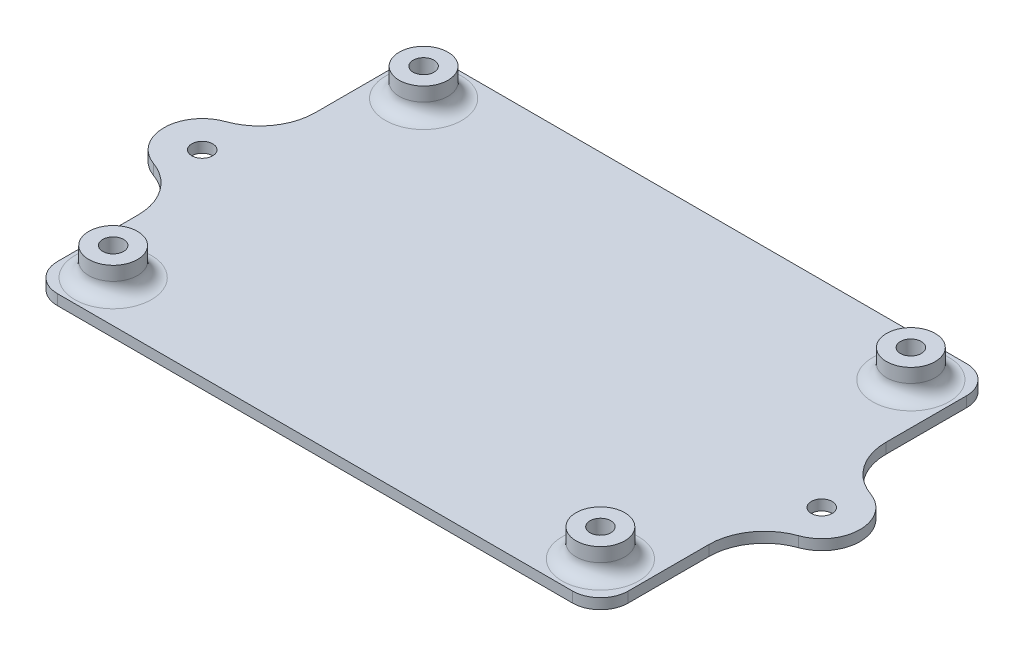
ISO-10303-21;
HEADER;
FILE_DESCRIPTION(('STEP AP214'),'2;1');
FILE_NAME('part.step','',(''),(''),'','','');
FILE_SCHEMA(('AUTOMOTIVE_DESIGN { 1 0 10303 214 1 1 1 1 }'));
ENDSEC;
DATA;
#1=APPLICATION_CONTEXT('core data for automotive mechanical design processes');
#2=APPLICATION_PROTOCOL_DEFINITION('international standard','automotive_design',2000,#1);
#3=PRODUCT_CONTEXT('',#1,'mechanical');
#4=PRODUCT('Part','Part','',(#3));
#5=PRODUCT_RELATED_PRODUCT_CATEGORY('part','',(#4));
#6=PRODUCT_DEFINITION_FORMATION('','',#4);
#7=PRODUCT_DEFINITION_CONTEXT('part definition',#1,'design');
#8=PRODUCT_DEFINITION('design','',#6,#7);
#9=PRODUCT_DEFINITION_SHAPE('','',#8);
#10=(LENGTH_UNIT() NAMED_UNIT(*) SI_UNIT(.MILLI.,.METRE.));
#11=(NAMED_UNIT(*) PLANE_ANGLE_UNIT() SI_UNIT($,.RADIAN.));
#12=(NAMED_UNIT(*) SI_UNIT($,.STERADIAN.) SOLID_ANGLE_UNIT());
#13=UNCERTAINTY_MEASURE_WITH_UNIT(LENGTH_MEASURE(1.E-05),#10,'distance_accuracy_value','');
#14=(GEOMETRIC_REPRESENTATION_CONTEXT(3) GLOBAL_UNCERTAINTY_ASSIGNED_CONTEXT((#13)) GLOBAL_UNIT_ASSIGNED_CONTEXT((#10,
#11,#12)) REPRESENTATION_CONTEXT('',''));
#15=CARTESIAN_POINT('',(0.,0.,0.));
#16=DIRECTION('',(0.,0.,1.));
#17=DIRECTION('',(1.,0.,0.));
#18=AXIS2_PLACEMENT_3D('',#15,#16,#17);
#19=CARTESIAN_POINT('',(0.,1.5,28.3));
#20=DIRECTION('',(0.,0.,-1.));
#21=DIRECTION('',(-1.,0.,0.));
#22=AXIS2_PLACEMENT_3D('',#19,#20,#21);
#23=PLANE('',#22);
#24=DIRECTION('',(1.,0.,0.));
#25=VECTOR('',#24,1.);
#26=CARTESIAN_POINT('',(0.,1.5,28.3));
#27=LINE('',#26,#25);
#28=CARTESIAN_POINT('',(-37.,1.5,28.3));
#29=VERTEX_POINT('',#28);
#30=CARTESIAN_POINT('',(37.,1.5,28.3));
#31=VERTEX_POINT('',#30);
#32=EDGE_CURVE('E166',#29,#31,#27,.T.);
#33=ORIENTED_EDGE('',*,*,#32,.F.);
#34=DIRECTION('',(0.,-1.,0.));
#35=VECTOR('',#34,1.);
#36=CARTESIAN_POINT('',(-37.,0.,28.3));
#37=LINE('',#36,#35);
#38=CARTESIAN_POINT('',(-37.,0.,28.3));
#39=VERTEX_POINT('',#38);
#40=EDGE_CURVE('E284',#29,#39,#37,.T.);
#41=ORIENTED_EDGE('',*,*,#40,.T.);
#42=DIRECTION('',(1.,0.,0.));
#43=VECTOR('',#42,1.);
#44=CARTESIAN_POINT('',(0.,0.,28.3));
#45=LINE('',#44,#43);
#46=CARTESIAN_POINT('',(37.,0.,28.3));
#47=VERTEX_POINT('',#46);
#48=EDGE_CURVE('E208',#39,#47,#45,.T.);
#49=ORIENTED_EDGE('',*,*,#48,.T.);
#50=DIRECTION('',(0.,-1.,0.));
#51=VECTOR('',#50,1.);
#52=CARTESIAN_POINT('',(37.,1.5,28.3));
#53=LINE('',#52,#51);
#54=EDGE_CURVE('E282',#47,#31,#53,.F.);
#55=ORIENTED_EDGE('',*,*,#54,.T.);
#56=EDGE_LOOP('',(#33,#41,#49,#55));
#57=FACE_BOUND('',#56,.T.);
#58=ADVANCED_FACE('F37',(#57),#23,.F.);
#59=CARTESIAN_POINT('',(41.,1.5,0.));
#60=DIRECTION('',(-1.,0.,0.));
#61=DIRECTION('',(0.,0.,1.));
#62=AXIS2_PLACEMENT_3D('',#59,#60,#61);
#63=PLANE('',#62);
#64=DIRECTION('',(0.,0.,-1.));
#65=VECTOR('',#64,1.);
#66=CARTESIAN_POINT('',(41.,1.5,0.));
#67=LINE('',#66,#65);
#68=CARTESIAN_POINT('',(41.,1.5,24.3));
#69=VERTEX_POINT('',#68);
#70=CARTESIAN_POINT('',(41.,1.5,12.7279220613579));
#71=VERTEX_POINT('',#70);
#72=EDGE_CURVE('E151',#69,#71,#67,.T.);
#73=ORIENTED_EDGE('',*,*,#72,.F.);
#74=DIRECTION('',(0.,-1.,0.));
#75=VECTOR('',#74,1.);
#76=CARTESIAN_POINT('',(41.,1.5,24.3));
#77=LINE('',#76,#75);
#78=CARTESIAN_POINT('',(41.,0.,24.3));
#79=VERTEX_POINT('',#78);
#80=EDGE_CURVE('E302',#69,#79,#77,.T.);
#81=ORIENTED_EDGE('',*,*,#80,.T.);
#82=DIRECTION('',(0.,0.,-1.));
#83=VECTOR('',#82,1.);
#84=CARTESIAN_POINT('',(41.,0.,0.));
#85=LINE('',#84,#83);
#86=CARTESIAN_POINT('',(41.,0.,12.7279220613579));
#87=VERTEX_POINT('',#86);
#88=EDGE_CURVE('E173',#79,#87,#85,.T.);
#89=ORIENTED_EDGE('',*,*,#88,.T.);
#90=DIRECTION('',(0.,-1.,0.));
#91=VECTOR('',#90,1.);
#92=CARTESIAN_POINT('',(41.,1.5,12.7279220613579));
#93=LINE('',#92,#91);
#94=EDGE_CURVE('E170',#71,#87,#93,.T.);
#95=ORIENTED_EDGE('',*,*,#94,.F.);
#96=EDGE_LOOP('',(#73,#81,#89,#95));
#97=FACE_BOUND('',#96,.T.);
#98=ADVANCED_FACE('F171',(#97),#63,.F.);
#99=CARTESIAN_POINT('',(49.,1.5,12.7279220613579));
#100=DIRECTION('',(0.,-1.,0.));
#101=DIRECTION('',(0.,0.,-1.));
#102=AXIS2_PLACEMENT_3D('',#99,#100,#101);
#103=CYLINDRICAL_SURFACE('',#102,8.);
#104=CARTESIAN_POINT('',(49.,0.,12.7279220613579));
#105=DIRECTION('',(0.,1.,0.));
#106=DIRECTION('',(0.,0.,1.));
#107=AXIS2_PLACEMENT_3D('',#104,#105,#106);
#108=CIRCLE('',#107,8.);
#109=CARTESIAN_POINT('',(46.3333333333333,0.,5.18544972870135));
#110=VERTEX_POINT('',#109);
#111=EDGE_CURVE('E213',#110,#87,#108,.T.);
#112=ORIENTED_EDGE('',*,*,#111,.F.);
#113=DIRECTION('',(0.,-1.,0.));
#114=VECTOR('',#113,1.);
#115=CARTESIAN_POINT('',(46.3333333333333,1.5,5.18544972870135));
#116=LINE('',#115,#114);
#117=CARTESIAN_POINT('',(46.3333333333333,1.5,5.18544972870135));
#118=VERTEX_POINT('',#117);
#119=EDGE_CURVE('E178',#118,#110,#116,.T.);
#120=ORIENTED_EDGE('',*,*,#119,.F.);
#121=CARTESIAN_POINT('',(49.,1.5,12.7279220613579));
#122=DIRECTION('',(0.,1.,0.));
#123=DIRECTION('',(0.,0.,1.));
#124=AXIS2_PLACEMENT_3D('',#121,#122,#123);
#125=CIRCLE('',#124,8.);
#126=EDGE_CURVE('E158',#118,#71,#125,.T.);
#127=ORIENTED_EDGE('',*,*,#126,.T.);
#128=ORIENTED_EDGE('',*,*,#94,.T.);
#129=EDGE_LOOP('',(#112,#120,#127,#128));
#130=FACE_BOUND('',#129,.T.);
#131=ADVANCED_FACE('F180',(#130),#103,.F.);
#132=CARTESIAN_POINT('',(44.5,1.5,0.));
#133=DIRECTION('',(0.,-1.,0.));
#134=DIRECTION('',(0.,0.,-1.));
#135=AXIS2_PLACEMENT_3D('',#132,#133,#134);
#136=CYLINDRICAL_SURFACE('',#135,5.5);
#137=CARTESIAN_POINT('',(44.5,0.,0.));
#138=DIRECTION('',(0.,1.,0.));
#139=DIRECTION('',(0.,0.,1.));
#140=AXIS2_PLACEMENT_3D('',#137,#138,#139);
#141=CIRCLE('',#140,5.5);
#142=CARTESIAN_POINT('',(46.3333333333333,0.,-5.18544972870135));
#143=VERTEX_POINT('',#142);
#144=EDGE_CURVE('E216',#143,#110,#141,.F.);
#145=ORIENTED_EDGE('',*,*,#144,.F.);
#146=DIRECTION('',(0.,-1.,0.));
#147=VECTOR('',#146,1.);
#148=CARTESIAN_POINT('',(46.3333333333333,1.5,-5.18544972870135));
#149=LINE('',#148,#147);
#150=CARTESIAN_POINT('',(46.3333333333333,1.5,-5.18544972870135));
#151=VERTEX_POINT('',#150);
#152=EDGE_CURVE('E254',#151,#143,#149,.T.);
#153=ORIENTED_EDGE('',*,*,#152,.F.);
#154=CARTESIAN_POINT('',(44.5,1.5,0.));
#155=DIRECTION('',(0.,1.,0.));
#156=DIRECTION('',(0.,0.,1.));
#157=AXIS2_PLACEMENT_3D('',#154,#155,#156);
#158=CIRCLE('',#157,5.5);
#159=EDGE_CURVE('E181',#151,#118,#158,.F.);
#160=ORIENTED_EDGE('',*,*,#159,.T.);
#161=ORIENTED_EDGE('',*,*,#119,.T.);
#162=EDGE_LOOP('',(#145,#153,#160,#161));
#163=FACE_BOUND('',#162,.T.);
#164=ADVANCED_FACE('F750',(#163),#136,.T.);
#165=CARTESIAN_POINT('',(49.,1.5,-12.7279220613579));
#166=DIRECTION('',(0.,-1.,0.));
#167=DIRECTION('',(0.,0.,-1.));
#168=AXIS2_PLACEMENT_3D('',#165,#166,#167);
#169=CYLINDRICAL_SURFACE('',#168,7.99999999999999);
#170=CARTESIAN_POINT('',(49.,0.,-12.7279220613579));
#171=DIRECTION('',(0.,1.,0.));
#172=DIRECTION('',(0.,0.,1.));
#173=AXIS2_PLACEMENT_3D('',#170,#171,#172);
#174=CIRCLE('',#173,7.99999999999999);
#175=CARTESIAN_POINT('',(41.,0.,-12.7279220613579));
#176=VERTEX_POINT('',#175);
#177=EDGE_CURVE('E219',#176,#143,#174,.T.);
#178=ORIENTED_EDGE('',*,*,#177,.F.);
#179=DIRECTION('',(0.,-1.,0.));
#180=VECTOR('',#179,1.);
#181=CARTESIAN_POINT('',(41.,1.5,-12.7279220613579));
#182=LINE('',#181,#180);
#183=CARTESIAN_POINT('',(41.,1.5,-12.7279220613579));
#184=VERTEX_POINT('',#183);
#185=EDGE_CURVE('E252',#184,#176,#182,.T.);
#186=ORIENTED_EDGE('',*,*,#185,.F.);
#187=CARTESIAN_POINT('',(49.,1.5,-12.7279220613579));
#188=DIRECTION('',(0.,1.,0.));
#189=DIRECTION('',(0.,0.,1.));
#190=AXIS2_PLACEMENT_3D('',#187,#188,#189);
#191=CIRCLE('',#190,7.99999999999999);
#192=EDGE_CURVE('E183',#184,#151,#191,.T.);
#193=ORIENTED_EDGE('',*,*,#192,.T.);
#194=ORIENTED_EDGE('',*,*,#152,.T.);
#195=EDGE_LOOP('',(#178,#186,#193,#194));
#196=FACE_BOUND('',#195,.T.);
#197=ADVANCED_FACE('F526',(#196),#169,.F.);
#198=CARTESIAN_POINT('',(41.,0.,-24.3));
#199=VERTEX_POINT('',#198);
#200=EDGE_CURVE('E214',#176,#199,#85,.T.);
#201=ORIENTED_EDGE('',*,*,#200,.T.);
#202=DIRECTION('',(0.,-1.,0.));
#203=VECTOR('',#202,1.);
#204=CARTESIAN_POINT('',(41.,1.5,-24.3));
#205=LINE('',#204,#203);
#206=CARTESIAN_POINT('',(41.,1.5,-24.3));
#207=VERTEX_POINT('',#206);
#208=EDGE_CURVE('E45',#199,#207,#205,.F.);
#209=ORIENTED_EDGE('',*,*,#208,.T.);
#210=EDGE_CURVE('E168',#184,#207,#67,.T.);
#211=ORIENTED_EDGE('',*,*,#210,.F.);
#212=ORIENTED_EDGE('',*,*,#185,.T.);
#213=EDGE_LOOP('',(#201,#209,#211,#212));
#214=FACE_BOUND('',#213,.T.);
#215=ADVANCED_FACE('F312',(#214),#63,.F.);
#216=CARTESIAN_POINT('',(0.,1.5,-28.3));
#217=DIRECTION('',(0.,0.,-1.));
#218=DIRECTION('',(-1.,0.,0.));
#219=AXIS2_PLACEMENT_3D('',#216,#217,#218);
#220=PLANE('',#219);
#221=DIRECTION('',(1.,0.,0.));
#222=VECTOR('',#221,1.);
#223=CARTESIAN_POINT('',(0.,1.5,-28.3));
#224=LINE('',#223,#222);
#225=CARTESIAN_POINT('',(-37.,1.5,-28.3));
#226=VERTEX_POINT('',#225);
#227=CARTESIAN_POINT('',(37.,1.5,-28.3));
#228=VERTEX_POINT('',#227);
#229=EDGE_CURVE('E189',#226,#228,#224,.T.);
#230=ORIENTED_EDGE('',*,*,#229,.T.);
#231=DIRECTION('',(0.,-1.,0.));
#232=VECTOR('',#231,1.);
#233=CARTESIAN_POINT('',(37.,0.,-28.3));
#234=LINE('',#233,#232);
#235=CARTESIAN_POINT('',(37.,0.,-28.3));
#236=VERTEX_POINT('',#235);
#237=EDGE_CURVE('E306',#228,#236,#234,.T.);
#238=ORIENTED_EDGE('',*,*,#237,.T.);
#239=DIRECTION('',(1.,0.,0.));
#240=VECTOR('',#239,1.);
#241=CARTESIAN_POINT('',(0.,0.,-28.3));
#242=LINE('',#241,#240);
#243=CARTESIAN_POINT('',(-37.,0.,-28.3));
#244=VERTEX_POINT('',#243);
#245=EDGE_CURVE('E222',#244,#236,#242,.T.);
#246=ORIENTED_EDGE('',*,*,#245,.F.);
#247=DIRECTION('',(0.,-1.,0.));
#248=VECTOR('',#247,1.);
#249=CARTESIAN_POINT('',(-37.,1.5,-28.3));
#250=LINE('',#249,#248);
#251=EDGE_CURVE('E304',#244,#226,#250,.F.);
#252=ORIENTED_EDGE('',*,*,#251,.T.);
#253=EDGE_LOOP('',(#230,#238,#246,#252));
#254=FACE_BOUND('',#253,.T.);
#255=ADVANCED_FACE('F320',(#254),#220,.T.);
#256=CARTESIAN_POINT('',(-41.,1.5,0.));
#257=DIRECTION('',(-1.,0.,0.));
#258=DIRECTION('',(0.,0.,1.));
#259=AXIS2_PLACEMENT_3D('',#256,#257,#258);
#260=PLANE('',#259);
#261=DIRECTION('',(0.,0.,-1.));
#262=VECTOR('',#261,1.);
#263=CARTESIAN_POINT('',(-41.,1.5,0.));
#264=LINE('',#263,#262);
#265=CARTESIAN_POINT('',(-41.,1.5,-12.7279220613578));
#266=VERTEX_POINT('',#265);
#267=CARTESIAN_POINT('',(-41.,1.5,-24.3));
#268=VERTEX_POINT('',#267);
#269=EDGE_CURVE('E191',#266,#268,#264,.T.);
#270=ORIENTED_EDGE('',*,*,#269,.T.);
#271=DIRECTION('',(0.,-1.,0.));
#272=VECTOR('',#271,1.);
#273=CARTESIAN_POINT('',(-41.,1.5,-24.3));
#274=LINE('',#273,#272);
#275=CARTESIAN_POINT('',(-41.,0.,-24.3));
#276=VERTEX_POINT('',#275);
#277=EDGE_CURVE('E12',#268,#276,#274,.T.);
#278=ORIENTED_EDGE('',*,*,#277,.T.);
#279=DIRECTION('',(0.,0.,-1.));
#280=VECTOR('',#279,1.);
#281=CARTESIAN_POINT('',(-41.,0.,0.));
#282=LINE('',#281,#280);
#283=CARTESIAN_POINT('',(-41.,0.,-12.7279220613578));
#284=VERTEX_POINT('',#283);
#285=EDGE_CURVE('E225',#284,#276,#282,.T.);
#286=ORIENTED_EDGE('',*,*,#285,.F.);
#287=DIRECTION('',(0.,-1.,0.));
#288=VECTOR('',#287,1.);
#289=CARTESIAN_POINT('',(-41.,1.5,-12.7279220613578));
#290=LINE('',#289,#288);
#291=EDGE_CURVE('E250',#266,#284,#290,.T.);
#292=ORIENTED_EDGE('',*,*,#291,.F.);
#293=EDGE_LOOP('',(#270,#278,#286,#292));
#294=FACE_BOUND('',#293,.T.);
#295=ADVANCED_FACE('F331',(#294),#260,.T.);
#296=CARTESIAN_POINT('',(-49.,1.5,-12.7279220613578));
#297=DIRECTION('',(0.,-1.,0.));
#298=DIRECTION('',(0.,0.,-1.));
#299=AXIS2_PLACEMENT_3D('',#296,#297,#298);
#300=CYLINDRICAL_SURFACE('',#299,8.);
#301=CARTESIAN_POINT('',(-49.,0.,-12.7279220613578));
#302=DIRECTION('',(0.,1.,0.));
#303=DIRECTION('',(0.,0.,1.));
#304=AXIS2_PLACEMENT_3D('',#301,#302,#303);
#305=CIRCLE('',#304,8.);
#306=CARTESIAN_POINT('',(-46.3333333333333,0.,-5.18544972870134));
#307=VERTEX_POINT('',#306);
#308=EDGE_CURVE('E228',#284,#307,#305,.F.);
#309=ORIENTED_EDGE('',*,*,#308,.T.);
#310=DIRECTION('',(0.,-1.,0.));
#311=VECTOR('',#310,1.);
#312=CARTESIAN_POINT('',(-46.3333333333333,1.5,-5.18544972870134));
#313=LINE('',#312,#311);
#314=CARTESIAN_POINT('',(-46.3333333333333,1.5,-5.18544972870134));
#315=VERTEX_POINT('',#314);
#316=EDGE_CURVE('E247',#315,#307,#313,.T.);
#317=ORIENTED_EDGE('',*,*,#316,.F.);
#318=CARTESIAN_POINT('',(-49.,1.5,-12.7279220613578));
#319=DIRECTION('',(0.,1.,0.));
#320=DIRECTION('',(0.,0.,1.));
#321=AXIS2_PLACEMENT_3D('',#318,#319,#320);
#322=CIRCLE('',#321,8.);
#323=EDGE_CURVE('E193',#266,#315,#322,.F.);
#324=ORIENTED_EDGE('',*,*,#323,.F.);
#325=ORIENTED_EDGE('',*,*,#291,.T.);
#326=EDGE_LOOP('',(#309,#317,#324,#325));
#327=FACE_BOUND('',#326,.T.);
#328=ADVANCED_FACE('F337',(#327),#300,.F.);
#329=CARTESIAN_POINT('',(-44.5,1.5,0.));
#330=DIRECTION('',(0.,-1.,0.));
#331=DIRECTION('',(0.,0.,-1.));
#332=AXIS2_PLACEMENT_3D('',#329,#330,#331);
#333=CYLINDRICAL_SURFACE('',#332,5.5);
#334=CARTESIAN_POINT('',(-44.5,0.,0.));
#335=DIRECTION('',(0.,1.,0.));
#336=DIRECTION('',(0.,0.,1.));
#337=AXIS2_PLACEMENT_3D('',#334,#335,#336);
#338=CIRCLE('',#337,5.5);
#339=CARTESIAN_POINT('',(-46.3333333333333,0.,5.18544972870136));
#340=VERTEX_POINT('',#339);
#341=EDGE_CURVE('E231',#307,#340,#338,.T.);
#342=ORIENTED_EDGE('',*,*,#341,.T.);
#343=DIRECTION('',(0.,-1.,0.));
#344=VECTOR('',#343,1.);
#345=CARTESIAN_POINT('',(-46.3333333333333,1.5,5.18544972870136));
#346=LINE('',#345,#344);
#347=CARTESIAN_POINT('',(-46.3333333333333,1.5,5.18544972870136));
#348=VERTEX_POINT('',#347);
#349=EDGE_CURVE('E244',#348,#340,#346,.T.);
#350=ORIENTED_EDGE('',*,*,#349,.F.);
#351=CARTESIAN_POINT('',(-44.5,1.5,0.));
#352=DIRECTION('',(0.,1.,0.));
#353=DIRECTION('',(0.,0.,1.));
#354=AXIS2_PLACEMENT_3D('',#351,#352,#353);
#355=CIRCLE('',#354,5.5);
#356=EDGE_CURVE('E196',#315,#348,#355,.T.);
#357=ORIENTED_EDGE('',*,*,#356,.F.);
#358=ORIENTED_EDGE('',*,*,#316,.T.);
#359=EDGE_LOOP('',(#342,#350,#357,#358));
#360=FACE_BOUND('',#359,.T.);
#361=ADVANCED_FACE('F340',(#360),#333,.T.);
#362=CARTESIAN_POINT('',(-49.,1.5,12.7279220613579));
#363=DIRECTION('',(0.,-1.,0.));
#364=DIRECTION('',(0.,0.,-1.));
#365=AXIS2_PLACEMENT_3D('',#362,#363,#364);
#366=CYLINDRICAL_SURFACE('',#365,8.);
#367=CARTESIAN_POINT('',(-49.,0.,12.7279220613579));
#368=DIRECTION('',(0.,1.,0.));
#369=DIRECTION('',(0.,0.,1.));
#370=AXIS2_PLACEMENT_3D('',#367,#368,#369);
#371=CIRCLE('',#370,8.);
#372=CARTESIAN_POINT('',(-41.,0.,12.7279220613579));
#373=VERTEX_POINT('',#372);
#374=EDGE_CURVE('E233',#340,#373,#371,.F.);
#375=ORIENTED_EDGE('',*,*,#374,.T.);
#376=DIRECTION('',(0.,-1.,0.));
#377=VECTOR('',#376,1.);
#378=CARTESIAN_POINT('',(-41.,1.5,12.7279220613579));
#379=LINE('',#378,#377);
#380=CARTESIAN_POINT('',(-41.,1.5,12.7279220613579));
#381=VERTEX_POINT('',#380);
#382=EDGE_CURVE('E207',#381,#373,#379,.T.);
#383=ORIENTED_EDGE('',*,*,#382,.F.);
#384=CARTESIAN_POINT('',(-49.,1.5,12.7279220613579));
#385=DIRECTION('',(0.,1.,0.));
#386=DIRECTION('',(0.,0.,1.));
#387=AXIS2_PLACEMENT_3D('',#384,#385,#386);
#388=CIRCLE('',#387,8.);
#389=EDGE_CURVE('E198',#348,#381,#388,.F.);
#390=ORIENTED_EDGE('',*,*,#389,.F.);
#391=ORIENTED_EDGE('',*,*,#349,.T.);
#392=EDGE_LOOP('',(#375,#383,#390,#391));
#393=FACE_BOUND('',#392,.T.);
#394=ADVANCED_FACE('F345',(#393),#366,.F.);
#395=CARTESIAN_POINT('',(-44.5,1.5,0.));
#396=DIRECTION('',(0.,-1.,0.));
#397=DIRECTION('',(0.,0.,-1.));
#398=AXIS2_PLACEMENT_3D('',#395,#396,#397);
#399=CYLINDRICAL_SURFACE('',#398,1.5);
#400=CARTESIAN_POINT('',(-44.5,1.5,0.));
#401=DIRECTION('',(0.,1.,0.));
#402=DIRECTION('',(0.,0.,1.));
#403=AXIS2_PLACEMENT_3D('',#400,#401,#402);
#404=CIRCLE('',#403,1.5);
#405=CARTESIAN_POINT('',(-44.5,1.5,1.50000000000001));
#406=VERTEX_POINT('',#405);
#407=EDGE_CURVE('E201',#406,#406,#404,.T.);
#408=ORIENTED_EDGE('',*,*,#407,.T.);
#409=EDGE_LOOP('',(#408));
#410=FACE_BOUND('',#409,.T.);
#411=CARTESIAN_POINT('',(-44.5,0.,0.));
#412=DIRECTION('',(0.,1.,0.));
#413=DIRECTION('',(0.,0.,1.));
#414=AXIS2_PLACEMENT_3D('',#411,#412,#413);
#415=CIRCLE('',#414,1.5);
#416=CARTESIAN_POINT('',(-44.5,0.,1.50000000000001));
#417=VERTEX_POINT('',#416);
#418=EDGE_CURVE('E236',#417,#417,#415,.T.);
#419=ORIENTED_EDGE('',*,*,#418,.F.);
#420=EDGE_LOOP('',(#419));
#421=FACE_BOUND('',#420,.T.);
#422=ADVANCED_FACE('F497',(#410,#421),#399,.F.);
#423=CARTESIAN_POINT('',(-41.,0.,24.3));
#424=VERTEX_POINT('',#423);
#425=EDGE_CURVE('E229',#424,#373,#282,.T.);
#426=ORIENTED_EDGE('',*,*,#425,.F.);
#427=DIRECTION('',(0.,-1.,0.));
#428=VECTOR('',#427,1.);
#429=CARTESIAN_POINT('',(-41.,1.5,24.3));
#430=LINE('',#429,#428);
#431=CARTESIAN_POINT('',(-41.,1.5,24.3));
#432=VERTEX_POINT('',#431);
#433=EDGE_CURVE('E295',#424,#432,#430,.F.);
#434=ORIENTED_EDGE('',*,*,#433,.T.);
#435=EDGE_CURVE('E194',#432,#381,#264,.T.);
#436=ORIENTED_EDGE('',*,*,#435,.T.);
#437=ORIENTED_EDGE('',*,*,#382,.T.);
#438=EDGE_LOOP('',(#426,#434,#436,#437));
#439=FACE_BOUND('',#438,.T.);
#440=ADVANCED_FACE('F492',(#439),#260,.T.);
#441=CARTESIAN_POINT('',(44.5,1.5,0.));
#442=DIRECTION('',(0.,-1.,0.));
#443=DIRECTION('',(0.,0.,-1.));
#444=AXIS2_PLACEMENT_3D('',#441,#442,#443);
#445=CYLINDRICAL_SURFACE('',#444,1.5);
#446=CARTESIAN_POINT('',(44.5,1.5,0.));
#447=DIRECTION('',(0.,1.,0.));
#448=DIRECTION('',(0.,0.,1.));
#449=AXIS2_PLACEMENT_3D('',#446,#447,#448);
#450=CIRCLE('',#449,1.5);
#451=CARTESIAN_POINT('',(44.5,1.5,1.50000000000001));
#452=VERTEX_POINT('',#451);
#453=EDGE_CURVE('E204',#452,#452,#450,.T.);
#454=ORIENTED_EDGE('',*,*,#453,.T.);
#455=EDGE_LOOP('',(#454));
#456=FACE_BOUND('',#455,.T.);
#457=CARTESIAN_POINT('',(44.5,0.,0.));
#458=DIRECTION('',(0.,1.,0.));
#459=DIRECTION('',(0.,0.,1.));
#460=AXIS2_PLACEMENT_3D('',#457,#458,#459);
#461=CIRCLE('',#460,1.5);
#462=CARTESIAN_POINT('',(44.5,0.,1.50000000000001));
#463=VERTEX_POINT('',#462);
#464=EDGE_CURVE('E239',#463,#463,#461,.T.);
#465=ORIENTED_EDGE('',*,*,#464,.F.);
#466=EDGE_LOOP('',(#465));
#467=FACE_BOUND('',#466,.T.);
#468=ADVANCED_FACE('F482',(#456,#467),#445,.F.);
#469=CARTESIAN_POINT('',(0.,1.5,0.));
#470=DIRECTION('',(0.,1.,0.));
#471=DIRECTION('',(0.,0.,1.));
#472=AXIS2_PLACEMENT_3D('',#469,#470,#471);
#473=PLANE('',#472);
#474=CARTESIAN_POINT('',(-35.,1.5,-22.3));
#475=DIRECTION('',(0.,1.,0.));
#476=DIRECTION('',(0.,0.,1.));
#477=AXIS2_PLACEMENT_3D('',#474,#475,#476);
#478=CIRCLE('',#477,5.5);
#479=CARTESIAN_POINT('',(-35.,1.5,-16.8));
#480=VERTEX_POINT('',#479);
#481=EDGE_CURVE('E267',#480,#480,#478,.F.);
#482=ORIENTED_EDGE('',*,*,#481,.T.);
#483=EDGE_LOOP('',(#482));
#484=FACE_BOUND('',#483,.T.);
#485=CARTESIAN_POINT('',(35.,1.5,-22.3));
#486=DIRECTION('',(0.,1.,0.));
#487=DIRECTION('',(0.,0.,1.));
#488=AXIS2_PLACEMENT_3D('',#485,#486,#487);
#489=CIRCLE('',#488,5.5);
#490=CARTESIAN_POINT('',(35.,1.5,-16.8));
#491=VERTEX_POINT('',#490);
#492=EDGE_CURVE('E264',#491,#491,#489,.F.);
#493=ORIENTED_EDGE('',*,*,#492,.T.);
#494=EDGE_LOOP('',(#493));
#495=FACE_BOUND('',#494,.T.);
#496=CARTESIAN_POINT('',(35.,1.5,22.3));
#497=DIRECTION('',(0.,1.,0.));
#498=DIRECTION('',(0.,0.,1.));
#499=AXIS2_PLACEMENT_3D('',#496,#497,#498);
#500=CIRCLE('',#499,5.5);
#501=CARTESIAN_POINT('',(35.,1.5,27.8));
#502=VERTEX_POINT('',#501);
#503=EDGE_CURVE('E260',#502,#502,#500,.F.);
#504=ORIENTED_EDGE('',*,*,#503,.T.);
#505=EDGE_LOOP('',(#504));
#506=FACE_BOUND('',#505,.T.);
#507=CARTESIAN_POINT('',(-35.,1.5,22.3));
#508=DIRECTION('',(0.,1.,0.));
#509=DIRECTION('',(0.,0.,1.));
#510=AXIS2_PLACEMENT_3D('',#507,#508,#509);
#511=CIRCLE('',#510,5.5);
#512=CARTESIAN_POINT('',(-35.,1.5,27.8));
#513=VERTEX_POINT('',#512);
#514=EDGE_CURVE('E257',#513,#513,#511,.F.);
#515=ORIENTED_EDGE('',*,*,#514,.T.);
#516=EDGE_LOOP('',(#515));
#517=FACE_BOUND('',#516,.T.);
#518=ORIENTED_EDGE('',*,*,#435,.F.);
#519=CARTESIAN_POINT('',(-37.,1.5,24.3));
#520=DIRECTION('',(0.,1.,0.));
#521=DIRECTION('',(0.,0.,1.));
#522=AXIS2_PLACEMENT_3D('',#519,#520,#521);
#523=CIRCLE('',#522,4.);
#524=EDGE_CURVE('E300',#432,#29,#523,.T.);
#525=ORIENTED_EDGE('',*,*,#524,.T.);
#526=ORIENTED_EDGE('',*,*,#32,.T.);
#527=CARTESIAN_POINT('',(37.,1.5,24.3));
#528=DIRECTION('',(0.,1.,0.));
#529=DIRECTION('',(0.,0.,1.));
#530=AXIS2_PLACEMENT_3D('',#527,#528,#529);
#531=CIRCLE('',#530,4.);
#532=EDGE_CURVE('E162',#31,#69,#531,.T.);
#533=ORIENTED_EDGE('',*,*,#532,.T.);
#534=ORIENTED_EDGE('',*,*,#72,.T.);
#535=ORIENTED_EDGE('',*,*,#126,.F.);
#536=ORIENTED_EDGE('',*,*,#159,.F.);
#537=ORIENTED_EDGE('',*,*,#192,.F.);
#538=ORIENTED_EDGE('',*,*,#210,.T.);
#539=CARTESIAN_POINT('',(37.,1.5,-24.3));
#540=DIRECTION('',(0.,1.,0.));
#541=DIRECTION('',(0.,0.,1.));
#542=AXIS2_PLACEMENT_3D('',#539,#540,#541);
#543=CIRCLE('',#542,4.);
#544=EDGE_CURVE('E58',#207,#228,#543,.T.);
#545=ORIENTED_EDGE('',*,*,#544,.T.);
#546=ORIENTED_EDGE('',*,*,#229,.F.);
#547=CARTESIAN_POINT('',(-37.,1.5,-24.3));
#548=DIRECTION('',(0.,1.,0.));
#549=DIRECTION('',(0.,0.,1.));
#550=AXIS2_PLACEMENT_3D('',#547,#548,#549);
#551=CIRCLE('',#550,4.);
#552=EDGE_CURVE('E52',#226,#268,#551,.T.);
#553=ORIENTED_EDGE('',*,*,#552,.T.);
#554=ORIENTED_EDGE('',*,*,#269,.F.);
#555=ORIENTED_EDGE('',*,*,#323,.T.);
#556=ORIENTED_EDGE('',*,*,#356,.T.);
#557=ORIENTED_EDGE('',*,*,#389,.T.);
#558=EDGE_LOOP('',(#518,#525,#526,#533,#534,#535,#536,#537,#538,#545,#546,#553,#554,#555,#556,#557));
#559=FACE_BOUND('',#558,.T.);
#560=ORIENTED_EDGE('',*,*,#407,.F.);
#561=EDGE_LOOP('',(#560));
#562=FACE_BOUND('',#561,.T.);
#563=ORIENTED_EDGE('',*,*,#453,.F.);
#564=EDGE_LOOP('',(#563));
#565=FACE_BOUND('',#564,.T.);
#566=ADVANCED_FACE('F154',(#484,#495,#506,#517,#559,#562,#565),#473,.T.);
#567=CARTESIAN_POINT('',(0.,0.,0.));
#568=DIRECTION('',(0.,1.,0.));
#569=DIRECTION('',(0.,0.,1.));
#570=AXIS2_PLACEMENT_3D('',#567,#568,#569);
#571=PLANE('',#570);
#572=ORIENTED_EDGE('',*,*,#48,.F.);
#573=CARTESIAN_POINT('',(-37.,0.,24.3));
#574=DIRECTION('',(0.,1.,0.));
#575=DIRECTION('',(0.,0.,1.));
#576=AXIS2_PLACEMENT_3D('',#573,#574,#575);
#577=CIRCLE('',#576,4.);
#578=EDGE_CURVE('E293',#39,#424,#577,.F.);
#579=ORIENTED_EDGE('',*,*,#578,.T.);
#580=ORIENTED_EDGE('',*,*,#425,.T.);
#581=ORIENTED_EDGE('',*,*,#374,.F.);
#582=ORIENTED_EDGE('',*,*,#341,.F.);
#583=ORIENTED_EDGE('',*,*,#308,.F.);
#584=ORIENTED_EDGE('',*,*,#285,.T.);
#585=CARTESIAN_POINT('',(-37.,0.,-24.3));
#586=DIRECTION('',(0.,1.,0.));
#587=DIRECTION('',(0.,0.,1.));
#588=AXIS2_PLACEMENT_3D('',#585,#586,#587);
#589=CIRCLE('',#588,4.);
#590=EDGE_CURVE('E287',#276,#244,#589,.F.);
#591=ORIENTED_EDGE('',*,*,#590,.T.);
#592=ORIENTED_EDGE('',*,*,#245,.T.);
#593=CARTESIAN_POINT('',(37.,0.,-24.3));
#594=DIRECTION('',(0.,1.,0.));
#595=DIRECTION('',(0.,0.,1.));
#596=AXIS2_PLACEMENT_3D('',#593,#594,#595);
#597=CIRCLE('',#596,4.);
#598=EDGE_CURVE('E289',#236,#199,#597,.F.);
#599=ORIENTED_EDGE('',*,*,#598,.T.);
#600=ORIENTED_EDGE('',*,*,#200,.F.);
#601=ORIENTED_EDGE('',*,*,#177,.T.);
#602=ORIENTED_EDGE('',*,*,#144,.T.);
#603=ORIENTED_EDGE('',*,*,#111,.T.);
#604=ORIENTED_EDGE('',*,*,#88,.F.);
#605=CARTESIAN_POINT('',(37.,0.,24.3));
#606=DIRECTION('',(0.,1.,0.));
#607=DIRECTION('',(0.,0.,1.));
#608=AXIS2_PLACEMENT_3D('',#605,#606,#607);
#609=CIRCLE('',#608,4.);
#610=EDGE_CURVE('E291',#79,#47,#609,.F.);
#611=ORIENTED_EDGE('',*,*,#610,.T.);
#612=EDGE_LOOP('',(#572,#579,#580,#581,#582,#583,#584,#591,#592,#599,#600,#601,#602,#603,#604,#611));
#613=FACE_BOUND('',#612,.T.);
#614=ORIENTED_EDGE('',*,*,#418,.T.);
#615=EDGE_LOOP('',(#614));
#616=FACE_BOUND('',#615,.T.);
#617=ORIENTED_EDGE('',*,*,#464,.T.);
#618=EDGE_LOOP('',(#617));
#619=FACE_BOUND('',#618,.T.);
#620=ADVANCED_FACE('F324',(#613,#616,#619),#571,.F.);
#621=CARTESIAN_POINT('',(-35.,19.3994949366117,-22.3));
#622=DIRECTION('',(0.,-1.,0.));
#623=DIRECTION('',(0.,0.,-1.));
#624=AXIS2_PLACEMENT_3D('',#621,#622,#623);
#625=CYLINDRICAL_SURFACE('',#624,1.5);
#626=CARTESIAN_POINT('',(-35.,1.5,-22.3));
#627=DIRECTION('',(0.,1.,0.));
#628=DIRECTION('',(0.,0.,1.));
#629=AXIS2_PLACEMENT_3D('',#626,#627,#628);
#630=CIRCLE('',#629,1.5);
#631=CARTESIAN_POINT('',(-35.,1.5,-20.8));
#632=VERTEX_POINT('',#631);
#633=EDGE_CURVE('E177',#632,#632,#630,.F.);
#634=ORIENTED_EDGE('',*,*,#633,.T.);
#635=EDGE_LOOP('',(#634));
#636=FACE_BOUND('',#635,.T.);
#637=CARTESIAN_POINT('',(-35.,5.5,-22.3));
#638=DIRECTION('',(0.,1.,0.));
#639=DIRECTION('',(0.,0.,1.));
#640=AXIS2_PLACEMENT_3D('',#637,#638,#639);
#641=CIRCLE('',#640,1.5);
#642=CARTESIAN_POINT('',(-35.,5.5,-20.8));
#643=VERTEX_POINT('',#642);
#644=EDGE_CURVE('E362',#643,#643,#641,.T.);
#645=ORIENTED_EDGE('',*,*,#644,.T.);
#646=EDGE_LOOP('',(#645));
#647=FACE_BOUND('',#646,.T.);
#648=ADVANCED_FACE('F470',(#636,#647),#625,.F.);
#649=CARTESIAN_POINT('',(-35.,19.3994949366117,-22.3));
#650=DIRECTION('',(0.,-1.,0.));
#651=DIRECTION('',(0.,0.,-1.));
#652=AXIS2_PLACEMENT_3D('',#649,#650,#651);
#653=CYLINDRICAL_SURFACE('',#652,3.5);
#654=CARTESIAN_POINT('',(-35.,3.5,-22.3));
#655=DIRECTION('',(0.,1.,0.));
#656=DIRECTION('',(0.,0.,1.));
#657=AXIS2_PLACEMENT_3D('',#654,#655,#656);
#658=CIRCLE('',#657,3.5);
#659=CARTESIAN_POINT('',(-35.,3.5,-18.8));
#660=VERTEX_POINT('',#659);
#661=EDGE_CURVE('E270',#660,#660,#658,.T.);
#662=ORIENTED_EDGE('',*,*,#661,.T.);
#663=EDGE_LOOP('',(#662));
#664=FACE_BOUND('',#663,.T.);
#665=CARTESIAN_POINT('',(-35.,5.5,-22.3));
#666=DIRECTION('',(0.,1.,0.));
#667=DIRECTION('',(0.,0.,1.));
#668=AXIS2_PLACEMENT_3D('',#665,#666,#667);
#669=CIRCLE('',#668,3.5);
#670=CARTESIAN_POINT('',(-35.,5.5,-18.8));
#671=VERTEX_POINT('',#670);
#672=EDGE_CURVE('E211',#671,#671,#669,.T.);
#673=ORIENTED_EDGE('',*,*,#672,.F.);
#674=EDGE_LOOP('',(#673));
#675=FACE_BOUND('',#674,.T.);
#676=ADVANCED_FACE('F606',(#664,#675),#653,.T.);
#677=CARTESIAN_POINT('',(0.,5.5,0.));
#678=DIRECTION('',(0.,1.,0.));
#679=DIRECTION('',(0.,0.,1.));
#680=AXIS2_PLACEMENT_3D('',#677,#678,#679);
#681=PLANE('',#680);
#682=ORIENTED_EDGE('',*,*,#644,.F.);
#683=EDGE_LOOP('',(#682));
#684=FACE_BOUND('',#683,.T.);
#685=ORIENTED_EDGE('',*,*,#672,.T.);
#686=EDGE_LOOP('',(#685));
#687=FACE_BOUND('',#686,.T.);
#688=ADVANCED_FACE('F611',(#684,#687),#681,.T.);
#689=ORIENTED_EDGE('',*,*,#633,.F.);
#690=EDGE_LOOP('',(#689));
#691=FACE_BOUND('',#690,.T.);
#692=ADVANCED_FACE('F485',(#691),#473,.T.);
#693=CARTESIAN_POINT('',(35.,19.3994949366117,-22.3));
#694=DIRECTION('',(0.,-1.,0.));
#695=DIRECTION('',(0.,0.,-1.));
#696=AXIS2_PLACEMENT_3D('',#693,#694,#695);
#697=CYLINDRICAL_SURFACE('',#696,1.5);
#698=CARTESIAN_POINT('',(35.,1.5,-22.3));
#699=DIRECTION('',(0.,1.,0.));
#700=DIRECTION('',(0.,0.,1.));
#701=AXIS2_PLACEMENT_3D('',#698,#699,#700);
#702=CIRCLE('',#701,1.5);
#703=CARTESIAN_POINT('',(35.,1.5,-20.8));
#704=VERTEX_POINT('',#703);
#705=EDGE_CURVE('E361',#704,#704,#702,.F.);
#706=ORIENTED_EDGE('',*,*,#705,.T.);
#707=EDGE_LOOP('',(#706));
#708=FACE_BOUND('',#707,.T.);
#709=CARTESIAN_POINT('',(35.,5.5,-22.3));
#710=DIRECTION('',(0.,1.,0.));
#711=DIRECTION('',(0.,0.,1.));
#712=AXIS2_PLACEMENT_3D('',#709,#710,#711);
#713=CIRCLE('',#712,1.5);
#714=CARTESIAN_POINT('',(35.,5.5,-20.8));
#715=VERTEX_POINT('',#714);
#716=EDGE_CURVE('E371',#715,#715,#713,.T.);
#717=ORIENTED_EDGE('',*,*,#716,.T.);
#718=EDGE_LOOP('',(#717));
#719=FACE_BOUND('',#718,.T.);
#720=ADVANCED_FACE('F596',(#708,#719),#697,.F.);
#721=CARTESIAN_POINT('',(35.,19.3994949366117,-22.3));
#722=DIRECTION('',(0.,-1.,0.));
#723=DIRECTION('',(0.,0.,-1.));
#724=AXIS2_PLACEMENT_3D('',#721,#722,#723);
#725=CYLINDRICAL_SURFACE('',#724,3.5);
#726=CARTESIAN_POINT('',(35.,3.5,-22.3));
#727=DIRECTION('',(0.,1.,0.));
#728=DIRECTION('',(0.,0.,1.));
#729=AXIS2_PLACEMENT_3D('',#726,#727,#728);
#730=CIRCLE('',#729,3.5);
#731=CARTESIAN_POINT('',(35.,3.5,-18.8));
#732=VERTEX_POINT('',#731);
#733=EDGE_CURVE('E273',#732,#732,#730,.T.);
#734=ORIENTED_EDGE('',*,*,#733,.T.);
#735=EDGE_LOOP('',(#734));
#736=FACE_BOUND('',#735,.T.);
#737=CARTESIAN_POINT('',(35.,5.5,-22.3));
#738=DIRECTION('',(0.,1.,0.));
#739=DIRECTION('',(0.,0.,1.));
#740=AXIS2_PLACEMENT_3D('',#737,#738,#739);
#741=CIRCLE('',#740,3.5);
#742=CARTESIAN_POINT('',(35.,5.5,-18.8));
#743=VERTEX_POINT('',#742);
#744=EDGE_CURVE('E365',#743,#743,#741,.T.);
#745=ORIENTED_EDGE('',*,*,#744,.F.);
#746=EDGE_LOOP('',(#745));
#747=FACE_BOUND('',#746,.T.);
#748=ADVANCED_FACE('F590',(#736,#747),#725,.T.);
#749=CARTESIAN_POINT('',(0.,5.5,0.));
#750=DIRECTION('',(0.,1.,0.));
#751=DIRECTION('',(0.,0.,1.));
#752=AXIS2_PLACEMENT_3D('',#749,#750,#751);
#753=PLANE('',#752);
#754=ORIENTED_EDGE('',*,*,#716,.F.);
#755=EDGE_LOOP('',(#754));
#756=FACE_BOUND('',#755,.T.);
#757=ORIENTED_EDGE('',*,*,#744,.T.);
#758=EDGE_LOOP('',(#757));
#759=FACE_BOUND('',#758,.T.);
#760=ADVANCED_FACE('F595',(#756,#759),#753,.T.);
#761=ORIENTED_EDGE('',*,*,#705,.F.);
#762=EDGE_LOOP('',(#761));
#763=FACE_BOUND('',#762,.T.);
#764=ADVANCED_FACE('F643',(#763),#473,.T.);
#765=CARTESIAN_POINT('',(35.,19.3994949366117,22.3));
#766=DIRECTION('',(0.,-1.,0.));
#767=DIRECTION('',(0.,0.,-1.));
#768=AXIS2_PLACEMENT_3D('',#765,#766,#767);
#769=CYLINDRICAL_SURFACE('',#768,1.5);
#770=CARTESIAN_POINT('',(35.,1.5,22.3));
#771=DIRECTION('',(0.,1.,0.));
#772=DIRECTION('',(0.,0.,1.));
#773=AXIS2_PLACEMENT_3D('',#770,#771,#772);
#774=CIRCLE('',#773,1.5);
#775=CARTESIAN_POINT('',(35.,1.5,23.8));
#776=VERTEX_POINT('',#775);
#777=EDGE_CURVE('E370',#776,#776,#774,.F.);
#778=ORIENTED_EDGE('',*,*,#777,.T.);
#779=EDGE_LOOP('',(#778));
#780=FACE_BOUND('',#779,.T.);
#781=CARTESIAN_POINT('',(35.,5.5,22.3));
#782=DIRECTION('',(0.,1.,0.));
#783=DIRECTION('',(0.,0.,1.));
#784=AXIS2_PLACEMENT_3D('',#781,#782,#783);
#785=CIRCLE('',#784,1.5);
#786=CARTESIAN_POINT('',(35.,5.5,23.8));
#787=VERTEX_POINT('',#786);
#788=EDGE_CURVE('E379',#787,#787,#785,.T.);
#789=ORIENTED_EDGE('',*,*,#788,.T.);
#790=EDGE_LOOP('',(#789));
#791=FACE_BOUND('',#790,.T.);
#792=ADVANCED_FACE('F580',(#780,#791),#769,.F.);
#793=CARTESIAN_POINT('',(35.,19.3994949366117,22.3));
#794=DIRECTION('',(0.,-1.,0.));
#795=DIRECTION('',(0.,0.,-1.));
#796=AXIS2_PLACEMENT_3D('',#793,#794,#795);
#797=CYLINDRICAL_SURFACE('',#796,3.5);
#798=CARTESIAN_POINT('',(35.,3.5,22.3));
#799=DIRECTION('',(0.,1.,0.));
#800=DIRECTION('',(0.,0.,1.));
#801=AXIS2_PLACEMENT_3D('',#798,#799,#800);
#802=CIRCLE('',#801,3.5);
#803=CARTESIAN_POINT('',(35.,3.5,25.8));
#804=VERTEX_POINT('',#803);
#805=EDGE_CURVE('E276',#804,#804,#802,.T.);
#806=ORIENTED_EDGE('',*,*,#805,.T.);
#807=EDGE_LOOP('',(#806));
#808=FACE_BOUND('',#807,.T.);
#809=CARTESIAN_POINT('',(35.,5.5,22.3));
#810=DIRECTION('',(0.,1.,0.));
#811=DIRECTION('',(0.,0.,1.));
#812=AXIS2_PLACEMENT_3D('',#809,#810,#811);
#813=CIRCLE('',#812,3.5);
#814=CARTESIAN_POINT('',(35.,5.5,25.8));
#815=VERTEX_POINT('',#814);
#816=EDGE_CURVE('E374',#815,#815,#813,.T.);
#817=ORIENTED_EDGE('',*,*,#816,.F.);
#818=EDGE_LOOP('',(#817));
#819=FACE_BOUND('',#818,.T.);
#820=ADVANCED_FACE('F574',(#808,#819),#797,.T.);
#821=CARTESIAN_POINT('',(0.,5.5,0.));
#822=DIRECTION('',(0.,1.,0.));
#823=DIRECTION('',(0.,0.,1.));
#824=AXIS2_PLACEMENT_3D('',#821,#822,#823);
#825=PLANE('',#824);
#826=ORIENTED_EDGE('',*,*,#788,.F.);
#827=EDGE_LOOP('',(#826));
#828=FACE_BOUND('',#827,.T.);
#829=ORIENTED_EDGE('',*,*,#816,.T.);
#830=EDGE_LOOP('',(#829));
#831=FACE_BOUND('',#830,.T.);
#832=ADVANCED_FACE('F579',(#828,#831),#825,.T.);
#833=ORIENTED_EDGE('',*,*,#777,.F.);
#834=EDGE_LOOP('',(#833));
#835=FACE_BOUND('',#834,.T.);
#836=ADVANCED_FACE('F407',(#835),#473,.T.);
#837=CARTESIAN_POINT('',(-35.,19.3994949366117,22.3));
#838=DIRECTION('',(0.,-1.,0.));
#839=DIRECTION('',(0.,0.,-1.));
#840=AXIS2_PLACEMENT_3D('',#837,#838,#839);
#841=CYLINDRICAL_SURFACE('',#840,1.5);
#842=CARTESIAN_POINT('',(-35.,1.5,22.3));
#843=DIRECTION('',(0.,1.,0.));
#844=DIRECTION('',(0.,0.,1.));
#845=AXIS2_PLACEMENT_3D('',#842,#843,#844);
#846=CIRCLE('',#845,1.5);
#847=CARTESIAN_POINT('',(-35.,1.5,23.8));
#848=VERTEX_POINT('',#847);
#849=EDGE_CURVE('E261',#848,#848,#846,.F.);
#850=ORIENTED_EDGE('',*,*,#849,.T.);
#851=EDGE_LOOP('',(#850));
#852=FACE_BOUND('',#851,.T.);
#853=CARTESIAN_POINT('',(-35.,5.5,22.3));
#854=DIRECTION('',(0.,1.,0.));
#855=DIRECTION('',(0.,0.,1.));
#856=AXIS2_PLACEMENT_3D('',#853,#854,#855);
#857=CIRCLE('',#856,1.5);
#858=CARTESIAN_POINT('',(-35.,5.5,23.8));
#859=VERTEX_POINT('',#858);
#860=EDGE_CURVE('E387',#859,#859,#857,.T.);
#861=ORIENTED_EDGE('',*,*,#860,.T.);
#862=EDGE_LOOP('',(#861));
#863=FACE_BOUND('',#862,.T.);
#864=ADVANCED_FACE('F397',(#852,#863),#841,.F.);
#865=CARTESIAN_POINT('',(-35.,19.3994949366117,22.3));
#866=DIRECTION('',(0.,-1.,0.));
#867=DIRECTION('',(0.,0.,-1.));
#868=AXIS2_PLACEMENT_3D('',#865,#866,#867);
#869=CYLINDRICAL_SURFACE('',#868,3.5);
#870=CARTESIAN_POINT('',(-35.,3.5,22.3));
#871=DIRECTION('',(0.,1.,0.));
#872=DIRECTION('',(0.,0.,1.));
#873=AXIS2_PLACEMENT_3D('',#870,#871,#872);
#874=CIRCLE('',#873,3.5);
#875=CARTESIAN_POINT('',(-35.,3.5,25.8));
#876=VERTEX_POINT('',#875);
#877=EDGE_CURVE('E279',#876,#876,#874,.T.);
#878=ORIENTED_EDGE('',*,*,#877,.T.);
#879=EDGE_LOOP('',(#878));
#880=FACE_BOUND('',#879,.T.);
#881=CARTESIAN_POINT('',(-35.,5.5,22.3));
#882=DIRECTION('',(0.,1.,0.));
#883=DIRECTION('',(0.,0.,1.));
#884=AXIS2_PLACEMENT_3D('',#881,#882,#883);
#885=CIRCLE('',#884,3.5);
#886=CARTESIAN_POINT('',(-35.,5.5,25.8));
#887=VERTEX_POINT('',#886);
#888=EDGE_CURVE('E382',#887,#887,#885,.T.);
#889=ORIENTED_EDGE('',*,*,#888,.F.);
#890=EDGE_LOOP('',(#889));
#891=FACE_BOUND('',#890,.T.);
#892=ADVANCED_FACE('F395',(#880,#891),#869,.T.);
#893=CARTESIAN_POINT('',(0.,5.5,0.));
#894=DIRECTION('',(0.,1.,0.));
#895=DIRECTION('',(0.,0.,1.));
#896=AXIS2_PLACEMENT_3D('',#893,#894,#895);
#897=PLANE('',#896);
#898=ORIENTED_EDGE('',*,*,#860,.F.);
#899=EDGE_LOOP('',(#898));
#900=FACE_BOUND('',#899,.T.);
#901=ORIENTED_EDGE('',*,*,#888,.T.);
#902=EDGE_LOOP('',(#901));
#903=FACE_BOUND('',#902,.T.);
#904=ADVANCED_FACE('F393',(#900,#903),#897,.T.);
#905=ORIENTED_EDGE('',*,*,#849,.F.);
#906=EDGE_LOOP('',(#905));
#907=FACE_BOUND('',#906,.T.);
#908=ADVANCED_FACE('F404',(#907),#473,.T.);
#909=CARTESIAN_POINT('',(-35.,3.5,-22.3));
#910=DIRECTION('',(0.,1.,0.));
#911=DIRECTION('',(0.,0.,1.));
#912=AXIS2_PLACEMENT_3D('',#909,#910,#911);
#913=TOROIDAL_SURFACE('',#912,5.5,2.);
#914=ORIENTED_EDGE('',*,*,#661,.F.);
#915=EDGE_LOOP('',(#914));
#916=FACE_BOUND('',#915,.T.);
#917=ORIENTED_EDGE('',*,*,#481,.F.);
#918=EDGE_LOOP('',(#917));
#919=FACE_BOUND('',#918,.T.);
#920=ADVANCED_FACE('F419',(#916,#919),#913,.F.);
#921=CARTESIAN_POINT('',(35.,3.5,-22.3));
#922=DIRECTION('',(0.,1.,0.));
#923=DIRECTION('',(0.,0.,1.));
#924=AXIS2_PLACEMENT_3D('',#921,#922,#923);
#925=TOROIDAL_SURFACE('',#924,5.5,2.);
#926=ORIENTED_EDGE('',*,*,#733,.F.);
#927=EDGE_LOOP('',(#926));
#928=FACE_BOUND('',#927,.T.);
#929=ORIENTED_EDGE('',*,*,#492,.F.);
#930=EDGE_LOOP('',(#929));
#931=FACE_BOUND('',#930,.T.);
#932=ADVANCED_FACE('F422',(#928,#931),#925,.F.);
#933=CARTESIAN_POINT('',(35.,3.5,22.3));
#934=DIRECTION('',(0.,1.,0.));
#935=DIRECTION('',(0.,0.,1.));
#936=AXIS2_PLACEMENT_3D('',#933,#934,#935);
#937=TOROIDAL_SURFACE('',#936,5.5,2.);
#938=ORIENTED_EDGE('',*,*,#805,.F.);
#939=EDGE_LOOP('',(#938));
#940=FACE_BOUND('',#939,.T.);
#941=ORIENTED_EDGE('',*,*,#503,.F.);
#942=EDGE_LOOP('',(#941));
#943=FACE_BOUND('',#942,.T.);
#944=ADVANCED_FACE('F426',(#940,#943),#937,.F.);
#945=CARTESIAN_POINT('',(-35.,3.5,22.3));
#946=DIRECTION('',(0.,1.,0.));
#947=DIRECTION('',(0.,0.,1.));
#948=AXIS2_PLACEMENT_3D('',#945,#946,#947);
#949=TOROIDAL_SURFACE('',#948,5.5,2.);
#950=ORIENTED_EDGE('',*,*,#877,.F.);
#951=EDGE_LOOP('',(#950));
#952=FACE_BOUND('',#951,.T.);
#953=ORIENTED_EDGE('',*,*,#514,.F.);
#954=EDGE_LOOP('',(#953));
#955=FACE_BOUND('',#954,.T.);
#956=ADVANCED_FACE('F430',(#952,#955),#949,.F.);
#957=CARTESIAN_POINT('',(-37.,1.5,24.3));
#958=DIRECTION('',(0.,1.,0.));
#959=DIRECTION('',(0.,0.,1.));
#960=AXIS2_PLACEMENT_3D('',#957,#958,#959);
#961=CYLINDRICAL_SURFACE('',#960,4.);
#962=ORIENTED_EDGE('',*,*,#524,.F.);
#963=ORIENTED_EDGE('',*,*,#433,.F.);
#964=ORIENTED_EDGE('',*,*,#578,.F.);
#965=ORIENTED_EDGE('',*,*,#40,.F.);
#966=EDGE_LOOP('',(#962,#963,#964,#965));
#967=FACE_BOUND('',#966,.T.);
#968=ADVANCED_FACE('F352',(#967),#961,.T.);
#969=CARTESIAN_POINT('',(37.,1.5,24.3));
#970=DIRECTION('',(0.,-1.,0.));
#971=DIRECTION('',(0.,0.,-1.));
#972=AXIS2_PLACEMENT_3D('',#969,#970,#971);
#973=CYLINDRICAL_SURFACE('',#972,4.);
#974=ORIENTED_EDGE('',*,*,#532,.F.);
#975=ORIENTED_EDGE('',*,*,#54,.F.);
#976=ORIENTED_EDGE('',*,*,#610,.F.);
#977=ORIENTED_EDGE('',*,*,#80,.F.);
#978=EDGE_LOOP('',(#974,#975,#976,#977));
#979=FACE_BOUND('',#978,.T.);
#980=ADVANCED_FACE('F357',(#979),#973,.T.);
#981=CARTESIAN_POINT('',(37.,1.5,-24.3));
#982=DIRECTION('',(0.,1.,0.));
#983=DIRECTION('',(0.,0.,1.));
#984=AXIS2_PLACEMENT_3D('',#981,#982,#983);
#985=CYLINDRICAL_SURFACE('',#984,4.);
#986=ORIENTED_EDGE('',*,*,#544,.F.);
#987=ORIENTED_EDGE('',*,*,#208,.F.);
#988=ORIENTED_EDGE('',*,*,#598,.F.);
#989=ORIENTED_EDGE('',*,*,#237,.F.);
#990=EDGE_LOOP('',(#986,#987,#988,#989));
#991=FACE_BOUND('',#990,.T.);
#992=ADVANCED_FACE('F317',(#991),#985,.T.);
#993=CARTESIAN_POINT('',(-37.,1.5,-24.3));
#994=DIRECTION('',(0.,-1.,0.));
#995=DIRECTION('',(0.,0.,-1.));
#996=AXIS2_PLACEMENT_3D('',#993,#994,#995);
#997=CYLINDRICAL_SURFACE('',#996,4.);
#998=ORIENTED_EDGE('',*,*,#552,.F.);
#999=ORIENTED_EDGE('',*,*,#251,.F.);
#1000=ORIENTED_EDGE('',*,*,#590,.F.);
#1001=ORIENTED_EDGE('',*,*,#277,.F.);
#1002=EDGE_LOOP('',(#998,#999,#1000,#1001));
#1003=FACE_BOUND('',#1002,.T.);
#1004=ADVANCED_FACE('F39',(#1003),#997,.T.);
#1005=CLOSED_SHELL('',(#58,#98,#131,#164,#197,#215,#255,#295,#328,#361,#394,#422,#440,#468,#566,
#620,#648,#676,#688,#692,#720,#748,#760,#764,#792,#820,#832,#836,#864,#892,#904,#908,#920,#932,
#944,#956,#968,#980,#992,#1004));
#1006=MANIFOLD_SOLID_BREP('B2',#1005);
#1007=ADVANCED_BREP_SHAPE_REPRESENTATION('',(#18,#1006),#14);
#1008=SHAPE_DEFINITION_REPRESENTATION(#9,#1007);
ENDSEC;
END-ISO-10303-21;
